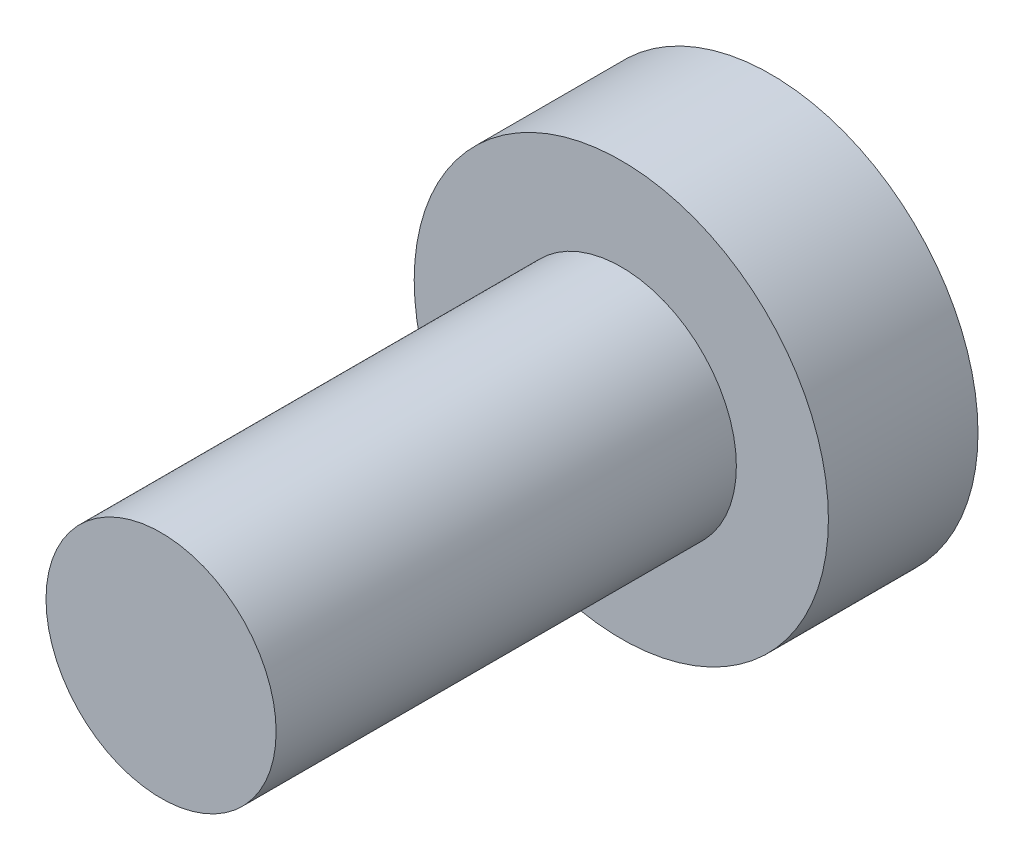
ISO-10303-21;
HEADER;
FILE_DESCRIPTION(('STEP AP214'),'2;1');
FILE_NAME('part.step','',(''),(''),'','','');
FILE_SCHEMA(('AUTOMOTIVE_DESIGN { 1 0 10303 214 1 1 1 1 }'));
ENDSEC;
DATA;
#1=APPLICATION_CONTEXT('core data for automotive mechanical design processes');
#2=APPLICATION_PROTOCOL_DEFINITION('international standard','automotive_design',2000,#1);
#3=PRODUCT_CONTEXT('',#1,'mechanical');
#4=PRODUCT('Part','Part','',(#3));
#5=PRODUCT_RELATED_PRODUCT_CATEGORY('part','',(#4));
#6=PRODUCT_DEFINITION_FORMATION('','',#4);
#7=PRODUCT_DEFINITION_CONTEXT('part definition',#1,'design');
#8=PRODUCT_DEFINITION('design','',#6,#7);
#9=PRODUCT_DEFINITION_SHAPE('','',#8);
#10=(LENGTH_UNIT() NAMED_UNIT(*) SI_UNIT(.MILLI.,.METRE.));
#11=(NAMED_UNIT(*) PLANE_ANGLE_UNIT() SI_UNIT($,.RADIAN.));
#12=(NAMED_UNIT(*) SI_UNIT($,.STERADIAN.) SOLID_ANGLE_UNIT());
#13=UNCERTAINTY_MEASURE_WITH_UNIT(LENGTH_MEASURE(1.E-05),#10,'distance_accuracy_value','');
#14=(GEOMETRIC_REPRESENTATION_CONTEXT(3) GLOBAL_UNCERTAINTY_ASSIGNED_CONTEXT((#13)) GLOBAL_UNIT_ASSIGNED_CONTEXT((#10,
#11,#12)) REPRESENTATION_CONTEXT('',''));
#15=CARTESIAN_POINT('',(0.,0.,0.));
#16=DIRECTION('',(0.,0.,1.));
#17=DIRECTION('',(1.,0.,0.));
#18=AXIS2_PLACEMENT_3D('',#15,#16,#17);
#19=CARTESIAN_POINT('',(0.,0.,1.3));
#20=DIRECTION('',(0.,0.,-1.));
#21=DIRECTION('',(-1.,0.,0.));
#22=AXIS2_PLACEMENT_3D('',#19,#20,#21);
#23=CYLINDRICAL_SURFACE('',#22,1.8);
#24=CARTESIAN_POINT('',(0.,0.,1.3));
#25=DIRECTION('',(0.,0.,1.));
#26=DIRECTION('',(1.,0.,0.));
#27=AXIS2_PLACEMENT_3D('',#24,#25,#26);
#28=CIRCLE('',#27,1.8);
#29=CARTESIAN_POINT('',(1.8,0.,1.3));
#30=VERTEX_POINT('',#29);
#31=EDGE_CURVE('E40',#30,#30,#28,.T.);
#32=ORIENTED_EDGE('',*,*,#31,.F.);
#33=EDGE_LOOP('',(#32));
#34=FACE_BOUND('',#33,.T.);
#35=CARTESIAN_POINT('',(0.,0.,0.));
#36=DIRECTION('',(0.,0.,1.));
#37=DIRECTION('',(1.,0.,0.));
#38=AXIS2_PLACEMENT_3D('',#35,#36,#37);
#39=CIRCLE('',#38,1.8);
#40=CARTESIAN_POINT('',(1.8,0.,0.));
#41=VERTEX_POINT('',#40);
#42=EDGE_CURVE('E36',#41,#41,#39,.T.);
#43=ORIENTED_EDGE('',*,*,#42,.T.);
#44=EDGE_LOOP('',(#43));
#45=FACE_BOUND('',#44,.T.);
#46=ADVANCED_FACE('F33',(#34,#45),#23,.T.);
#47=CARTESIAN_POINT('',(0.,0.,1.3));
#48=DIRECTION('',(0.,0.,1.));
#49=DIRECTION('',(1.,0.,0.));
#50=AXIS2_PLACEMENT_3D('',#47,#48,#49);
#51=PLANE('',#50);
#52=CARTESIAN_POINT('',(0.,0.,1.3));
#53=DIRECTION('',(0.,0.,1.));
#54=DIRECTION('',(1.,0.,0.));
#55=AXIS2_PLACEMENT_3D('',#52,#53,#54);
#56=CIRCLE('',#55,1.);
#57=CARTESIAN_POINT('',(1.,0.,1.3));
#58=VERTEX_POINT('',#57);
#59=EDGE_CURVE('E10',#58,#58,#56,.T.);
#60=ORIENTED_EDGE('',*,*,#59,.F.);
#61=EDGE_LOOP('',(#60));
#62=FACE_BOUND('',#61,.T.);
#63=ORIENTED_EDGE('',*,*,#31,.T.);
#64=EDGE_LOOP('',(#63));
#65=FACE_BOUND('',#64,.T.);
#66=ADVANCED_FACE('F57',(#62,#65),#51,.T.);
#67=CARTESIAN_POINT('',(0.,0.,0.));
#68=DIRECTION('',(0.,0.,1.));
#69=DIRECTION('',(1.,0.,0.));
#70=AXIS2_PLACEMENT_3D('',#67,#68,#69);
#71=PLANE('',#70);
#72=ORIENTED_EDGE('',*,*,#42,.F.);
#73=EDGE_LOOP('',(#72));
#74=FACE_BOUND('',#73,.T.);
#75=ADVANCED_FACE('F54',(#74),#71,.F.);
#76=CARTESIAN_POINT('',(0.,0.,5.3));
#77=DIRECTION('',(0.,0.,-1.));
#78=DIRECTION('',(-1.,0.,0.));
#79=AXIS2_PLACEMENT_3D('',#76,#77,#78);
#80=CYLINDRICAL_SURFACE('',#79,1.);
#81=CARTESIAN_POINT('',(0.,0.,5.3));
#82=DIRECTION('',(0.,0.,1.));
#83=DIRECTION('',(1.,0.,0.));
#84=AXIS2_PLACEMENT_3D('',#81,#82,#83);
#85=CIRCLE('',#84,1.);
#86=CARTESIAN_POINT('',(1.,0.,5.3));
#87=VERTEX_POINT('',#86);
#88=EDGE_CURVE('E46',#87,#87,#85,.T.);
#89=ORIENTED_EDGE('',*,*,#88,.F.);
#90=EDGE_LOOP('',(#89));
#91=FACE_BOUND('',#90,.T.);
#92=ORIENTED_EDGE('',*,*,#59,.T.);
#93=EDGE_LOOP('',(#92));
#94=FACE_BOUND('',#93,.T.);
#95=ADVANCED_FACE('F56',(#91,#94),#80,.T.);
#96=CARTESIAN_POINT('',(0.,0.,5.3));
#97=DIRECTION('',(0.,0.,1.));
#98=DIRECTION('',(1.,0.,0.));
#99=AXIS2_PLACEMENT_3D('',#96,#97,#98);
#100=PLANE('',#99);
#101=ORIENTED_EDGE('',*,*,#88,.T.);
#102=EDGE_LOOP('',(#101));
#103=FACE_BOUND('',#102,.T.);
#104=ADVANCED_FACE('F62',(#103),#100,.T.);
#105=CLOSED_SHELL('',(#46,#66,#75,#95,#104));
#106=MANIFOLD_SOLID_BREP('B2',#105);
#107=ADVANCED_BREP_SHAPE_REPRESENTATION('',(#18,#106),#14);
#108=SHAPE_DEFINITION_REPRESENTATION(#9,#107);
ENDSEC;
END-ISO-10303-21;
